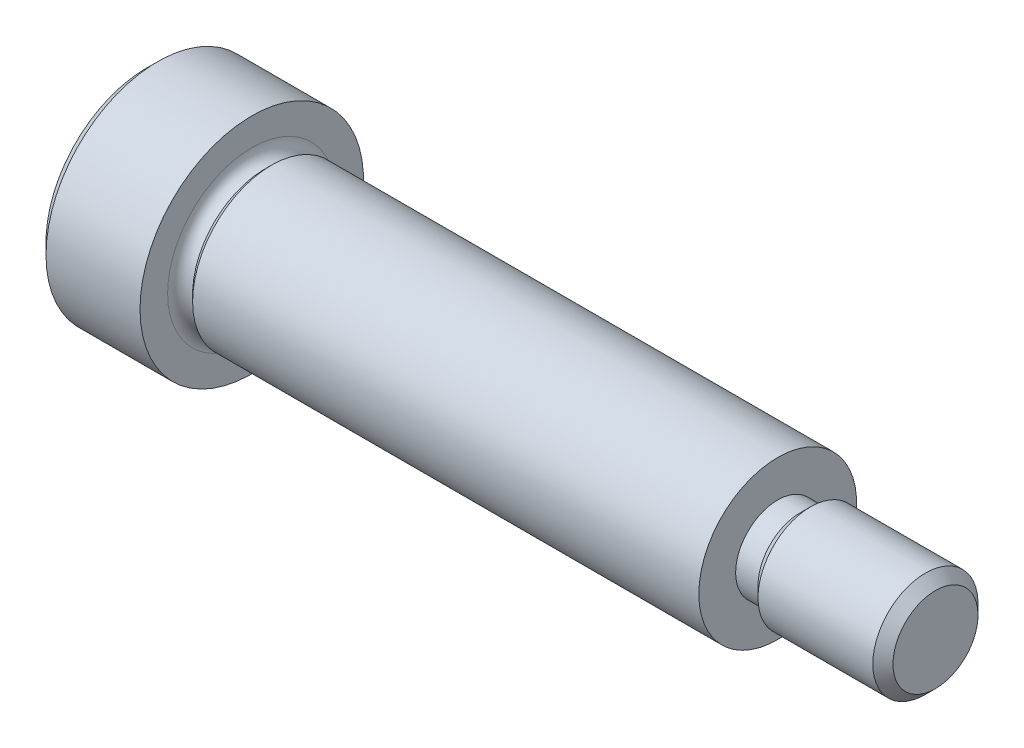
ISO-10303-21;
HEADER;
FILE_DESCRIPTION(('STEP AP214'),'2;1');
FILE_NAME('part.step','',(''),(''),'','','');
FILE_SCHEMA(('AUTOMOTIVE_DESIGN { 1 0 10303 214 1 1 1 1 }'));
ENDSEC;
DATA;
#1=APPLICATION_CONTEXT('core data for automotive mechanical design processes');
#2=APPLICATION_PROTOCOL_DEFINITION('international standard','automotive_design',2000,#1);
#3=PRODUCT_CONTEXT('',#1,'mechanical');
#4=PRODUCT('Part','Part','',(#3));
#5=PRODUCT_RELATED_PRODUCT_CATEGORY('part','',(#4));
#6=PRODUCT_DEFINITION_FORMATION('','',#4);
#7=PRODUCT_DEFINITION_CONTEXT('part definition',#1,'design');
#8=PRODUCT_DEFINITION('design','',#6,#7);
#9=PRODUCT_DEFINITION_SHAPE('','',#8);
#10=(LENGTH_UNIT() NAMED_UNIT(*) SI_UNIT(.MILLI.,.METRE.));
#11=(NAMED_UNIT(*) PLANE_ANGLE_UNIT() SI_UNIT($,.RADIAN.));
#12=(NAMED_UNIT(*) SI_UNIT($,.STERADIAN.) SOLID_ANGLE_UNIT());
#13=UNCERTAINTY_MEASURE_WITH_UNIT(LENGTH_MEASURE(1.E-05),#10,'distance_accuracy_value','');
#14=(GEOMETRIC_REPRESENTATION_CONTEXT(3) GLOBAL_UNCERTAINTY_ASSIGNED_CONTEXT((#13)) GLOBAL_UNIT_ASSIGNED_CONTEXT((#10,
#11,#12)) REPRESENTATION_CONTEXT('',''));
#15=CARTESIAN_POINT('',(0.,0.,0.));
#16=DIRECTION('',(0.,0.,1.));
#17=DIRECTION('',(1.,0.,0.));
#18=AXIS2_PLACEMENT_3D('',#15,#16,#17);
#19=CARTESIAN_POINT('',(-4.,0.,0.));
#20=DIRECTION('',(1.,0.,0.));
#21=DIRECTION('',(0.,0.,-1.));
#22=AXIS2_PLACEMENT_3D('',#19,#20,#21);
#23=PLANE('',#22);
#24=DIRECTION('',(0.,1.,0.));
#25=VECTOR('',#24,1.);
#26=CARTESIAN_POINT('',(-4.,0.,2.99999999999721));
#27=LINE('',#26,#25);
#28=CARTESIAN_POINT('',(-4.0000000000191,0.,2.99999999996453));
#29=VERTEX_POINT('',#28);
#30=CARTESIAN_POINT('',(-4.00000000000054,-1.73205080756995,2.99999999999814));
#31=VERTEX_POINT('',#30);
#32=EDGE_CURVE('E96',#29,#31,#27,.F.);
#33=ORIENTED_EDGE('',*,*,#32,.F.);
#34=CARTESIAN_POINT('',(-4.0000000000191,0.,0.));
#35=DIRECTION('',(-1.,0.,0.));
#36=DIRECTION('',(0.,0.,1.));
#37=AXIS2_PLACEMENT_3D('',#34,#35,#36);
#38=CIRCLE('',#37,2.99999999992906);
#39=CARTESIAN_POINT('',(-4.00000000000955,-2.59807621132259,1.49999999998227));
#40=VERTEX_POINT('',#39);
#41=EDGE_CURVE('E98',#29,#40,#38,.F.);
#42=ORIENTED_EDGE('',*,*,#41,.T.);
#43=DIRECTION('',(0.,-0.499999999999999,-0.866025403784439));
#44=VECTOR('',#43,1.);
#45=CARTESIAN_POINT('',(-4.,-1.73205080756888,3.));
#46=LINE('',#45,#44);
#47=EDGE_CURVE('E101',#31,#40,#46,.T.);
#48=ORIENTED_EDGE('',*,*,#47,.F.);
#49=EDGE_LOOP('',(#33,#42,#48));
#50=FACE_BOUND('',#49,.T.);
#51=ADVANCED_FACE('F17',(#50),#23,.F.);
#52=CARTESIAN_POINT('',(-4.,0.,0.));
#53=DIRECTION('',(1.,0.,0.));
#54=DIRECTION('',(0.,0.,-1.));
#55=AXIS2_PLACEMENT_3D('',#52,#53,#54);
#56=PLANE('',#55);
#57=DIRECTION('',(0.,-0.5,-0.866025403784439));
#58=VECTOR('',#57,1.);
#59=CARTESIAN_POINT('',(-4.,-2.59807621135331,1.50000000000001));
#60=LINE('',#59,#58);
#61=CARTESIAN_POINT('',(-4.,-3.46410161513775,0.));
#62=VERTEX_POINT('',#61);
#63=EDGE_CURVE('E163',#40,#62,#60,.T.);
#64=ORIENTED_EDGE('',*,*,#63,.F.);
#65=CARTESIAN_POINT('',(-4.0000000000191,0.,0.));
#66=DIRECTION('',(-1.,0.,0.));
#67=DIRECTION('',(0.,0.,1.));
#68=AXIS2_PLACEMENT_3D('',#65,#66,#67);
#69=CIRCLE('',#68,2.99999999992906);
#70=CARTESIAN_POINT('',(-4.0000000000191,-2.59807621131293,-1.49999999998784));
#71=VERTEX_POINT('',#70);
#72=EDGE_CURVE('E116',#40,#71,#69,.F.);
#73=ORIENTED_EDGE('',*,*,#72,.T.);
#74=DIRECTION('',(0.,0.500000000005582,-0.866025403781216));
#75=VECTOR('',#74,1.);
#76=CARTESIAN_POINT('',(-4.,-3.46410161513775,0.));
#77=LINE('',#76,#75);
#78=EDGE_CURVE('E159',#62,#71,#77,.T.);
#79=ORIENTED_EDGE('',*,*,#78,.F.);
#80=EDGE_LOOP('',(#64,#73,#79));
#81=FACE_BOUND('',#80,.T.);
#82=ADVANCED_FACE('F533',(#81),#56,.F.);
#83=CARTESIAN_POINT('',(-4.,0.,0.));
#84=DIRECTION('',(1.,0.,0.));
#85=DIRECTION('',(0.,0.,-1.));
#86=AXIS2_PLACEMENT_3D('',#83,#84,#85);
#87=PLANE('',#86);
#88=DIRECTION('',(0.,0.499999999994418,-0.866025403787662));
#89=VECTOR('',#88,1.);
#90=CARTESIAN_POINT('',(-4.,-2.59807621134365,-1.4999999999944));
#91=LINE('',#90,#89);
#92=CARTESIAN_POINT('',(-4.,-1.73205080756887,-3.));
#93=VERTEX_POINT('',#92);
#94=EDGE_CURVE('E155',#71,#93,#91,.T.);
#95=ORIENTED_EDGE('',*,*,#94,.F.);
#96=CARTESIAN_POINT('',(-4.0000000000191,0.,0.));
#97=DIRECTION('',(-1.,0.,0.));
#98=DIRECTION('',(0.,0.,1.));
#99=AXIS2_PLACEMENT_3D('',#96,#97,#98);
#100=CIRCLE('',#99,2.99999999992906);
#101=CARTESIAN_POINT('',(-4.0000000000191,0.,-2.99999999996453));
#102=VERTEX_POINT('',#101);
#103=EDGE_CURVE('E221',#71,#102,#100,.F.);
#104=ORIENTED_EDGE('',*,*,#103,.T.);
#105=DIRECTION('',(0.,1.,0.));
#106=VECTOR('',#105,1.);
#107=CARTESIAN_POINT('',(-4.,0.,-3.));
#108=LINE('',#107,#106);
#109=EDGE_CURVE('E151',#93,#102,#108,.T.);
#110=ORIENTED_EDGE('',*,*,#109,.F.);
#111=EDGE_LOOP('',(#95,#104,#110));
#112=FACE_BOUND('',#111,.T.);
#113=ADVANCED_FACE('F292',(#112),#87,.F.);
#114=CARTESIAN_POINT('',(-4.,0.,0.));
#115=DIRECTION('',(1.,0.,0.));
#116=DIRECTION('',(0.,0.,-1.));
#117=AXIS2_PLACEMENT_3D('',#114,#115,#116);
#118=PLANE('',#117);
#119=DIRECTION('',(0.,1.,0.));
#120=VECTOR('',#119,1.);
#121=CARTESIAN_POINT('',(-4.,0.,-2.99999999998882));
#122=LINE('',#121,#120);
#123=CARTESIAN_POINT('',(-4.,1.73205080757318,-2.99999999999255));
#124=VERTEX_POINT('',#123);
#125=EDGE_CURVE('E147',#102,#124,#122,.T.);
#126=ORIENTED_EDGE('',*,*,#125,.F.);
#127=CARTESIAN_POINT('',(-4.0000000000191,0.,0.));
#128=DIRECTION('',(-1.,0.,0.));
#129=DIRECTION('',(0.,0.,1.));
#130=AXIS2_PLACEMENT_3D('',#127,#128,#129);
#131=CIRCLE('',#130,2.99999999992906);
#132=CARTESIAN_POINT('',(-4.00000000000955,2.59807621132259,-1.49999999998227));
#133=VERTEX_POINT('',#132);
#134=EDGE_CURVE('E218',#102,#133,#131,.F.);
#135=ORIENTED_EDGE('',*,*,#134,.T.);
#136=DIRECTION('',(0.,0.499999999999999,0.866025403784439));
#137=VECTOR('',#136,1.);
#138=CARTESIAN_POINT('',(-4.,1.73205080756888,-3.));
#139=LINE('',#138,#137);
#140=EDGE_CURVE('E143',#124,#133,#139,.T.);
#141=ORIENTED_EDGE('',*,*,#140,.F.);
#142=EDGE_LOOP('',(#126,#135,#141));
#143=FACE_BOUND('',#142,.T.);
#144=ADVANCED_FACE('F278',(#143),#118,.F.);
#145=CARTESIAN_POINT('',(-4.,0.,0.));
#146=DIRECTION('',(1.,0.,0.));
#147=DIRECTION('',(0.,0.,-1.));
#148=AXIS2_PLACEMENT_3D('',#145,#146,#147);
#149=PLANE('',#148);
#150=DIRECTION('',(0.,0.5,0.866025403784439));
#151=VECTOR('',#150,1.);
#152=CARTESIAN_POINT('',(-4.,2.59807621135331,-1.50000000000001));
#153=LINE('',#152,#151);
#154=CARTESIAN_POINT('',(-4.,3.46410161513775,0.));
#155=VERTEX_POINT('',#154);
#156=EDGE_CURVE('E139',#133,#155,#153,.T.);
#157=ORIENTED_EDGE('',*,*,#156,.F.);
#158=CARTESIAN_POINT('',(-4.0000000000191,0.,0.));
#159=DIRECTION('',(-1.,0.,0.));
#160=DIRECTION('',(0.,0.,1.));
#161=AXIS2_PLACEMENT_3D('',#158,#159,#160);
#162=CIRCLE('',#161,2.99999999992906);
#163=CARTESIAN_POINT('',(-4.0000000000191,2.59807621132259,1.49999999998227));
#164=VERTEX_POINT('',#163);
#165=EDGE_CURVE('E125',#133,#164,#162,.F.);
#166=ORIENTED_EDGE('',*,*,#165,.T.);
#167=DIRECTION('',(0.,-0.500000000005583,0.866025403781215));
#168=VECTOR('',#167,1.);
#169=CARTESIAN_POINT('',(-4.,3.46410161513775,0.));
#170=LINE('',#169,#168);
#171=EDGE_CURVE('E117',#155,#164,#170,.T.);
#172=ORIENTED_EDGE('',*,*,#171,.F.);
#173=EDGE_LOOP('',(#157,#166,#172));
#174=FACE_BOUND('',#173,.T.);
#175=ADVANCED_FACE('F282',(#174),#149,.F.);
#176=CARTESIAN_POINT('',(-4.0000000000191,0.,0.));
#177=DIRECTION('',(-1.,0.,0.));
#178=DIRECTION('',(0.,0.,1.));
#179=AXIS2_PLACEMENT_3D('',#176,#177,#178);
#180=CONICAL_SURFACE('',#179,2.99999999992906,1.04719755118004);
#181=CARTESIAN_POINT('',(-2.26794919251461,0.,5.6843418860808E-11));
#182=VERTEX_POINT('',#181);
#183=VERTEX_LOOP('',#182);
#184=FACE_BOUND('',#183,.T.);
#185=ORIENTED_EDGE('',*,*,#41,.F.);
#186=CARTESIAN_POINT('',(-4.0000000000191,0.,0.));
#187=DIRECTION('',(-1.,0.,0.));
#188=DIRECTION('',(0.,0.,1.));
#189=AXIS2_PLACEMENT_3D('',#186,#187,#188);
#190=CIRCLE('',#189,2.99999999992906);
#191=EDGE_CURVE('E112',#29,#164,#190,.T.);
#192=ORIENTED_EDGE('',*,*,#191,.T.);
#193=ORIENTED_EDGE('',*,*,#165,.F.);
#194=ORIENTED_EDGE('',*,*,#134,.F.);
#195=ORIENTED_EDGE('',*,*,#103,.F.);
#196=ORIENTED_EDGE('',*,*,#72,.F.);
#197=EDGE_LOOP('',(#185,#192,#193,#194,#195,#196));
#198=FACE_BOUND('',#197,.T.);
#199=ADVANCED_FACE('F110',(#184,#198),#180,.F.);
#200=CARTESIAN_POINT('',(-4.,0.,0.));
#201=DIRECTION('',(1.,0.,0.));
#202=DIRECTION('',(0.,0.,-1.));
#203=AXIS2_PLACEMENT_3D('',#200,#201,#202);
#204=PLANE('',#203);
#205=DIRECTION('',(0.,0.5,-0.866025403784439));
#206=VECTOR('',#205,1.);
#207=CARTESIAN_POINT('',(-4.,3.46410161513775,0.));
#208=LINE('',#207,#206);
#209=CARTESIAN_POINT('',(-4.,1.73205080756887,3.));
#210=VERTEX_POINT('',#209);
#211=EDGE_CURVE('E124',#164,#210,#208,.F.);
#212=ORIENTED_EDGE('',*,*,#211,.F.);
#213=ORIENTED_EDGE('',*,*,#191,.F.);
#214=DIRECTION('',(0.,1.,0.));
#215=VECTOR('',#214,1.);
#216=CARTESIAN_POINT('',(-4.,1.73205080756888,3.));
#217=LINE('',#216,#215);
#218=EDGE_CURVE('E121',#210,#29,#217,.F.);
#219=ORIENTED_EDGE('',*,*,#218,.F.);
#220=EDGE_LOOP('',(#212,#213,#219));
#221=FACE_BOUND('',#220,.T.);
#222=ADVANCED_FACE('F120',(#221),#204,.F.);
#223=CARTESIAN_POINT('',(-4.,1.73205080756888,3.));
#224=DIRECTION('',(0.,0.,-1.));
#225=DIRECTION('',(-1.,0.,0.));
#226=AXIS2_PLACEMENT_3D('',#223,#224,#225);
#227=PLANE('',#226);
#228=DIRECTION('',(0.,1.,0.));
#229=VECTOR('',#228,1.);
#230=CARTESIAN_POINT('',(-8.,3.,3.));
#231=LINE('',#230,#229);
#232=CARTESIAN_POINT('',(-8.,-1.73205080756888,3.));
#233=VERTEX_POINT('',#232);
#234=CARTESIAN_POINT('',(-8.,1.73205080756888,3.));
#235=VERTEX_POINT('',#234);
#236=EDGE_CURVE('E196',#233,#235,#231,.T.);
#237=ORIENTED_EDGE('',*,*,#236,.T.);
#238=DIRECTION('',(1.,0.,0.));
#239=VECTOR('',#238,1.);
#240=CARTESIAN_POINT('',(-4.,1.73205080756887,3.));
#241=LINE('',#240,#239);
#242=EDGE_CURVE('E129',#210,#235,#241,.F.);
#243=ORIENTED_EDGE('',*,*,#242,.F.);
#244=ORIENTED_EDGE('',*,*,#218,.T.);
#245=ORIENTED_EDGE('',*,*,#32,.T.);
#246=DIRECTION('',(1.,0.,0.));
#247=VECTOR('',#246,1.);
#248=CARTESIAN_POINT('',(-4.,-1.73205080756888,3.));
#249=LINE('',#248,#247);
#250=EDGE_CURVE('E192',#233,#31,#249,.T.);
#251=ORIENTED_EDGE('',*,*,#250,.F.);
#252=EDGE_LOOP('',(#237,#243,#244,#245,#251));
#253=FACE_BOUND('',#252,.T.);
#254=ADVANCED_FACE('F127',(#253),#227,.T.);
#255=CARTESIAN_POINT('',(-4.,3.46410161513775,0.));
#256=DIRECTION('',(0.,-0.866025403784439,-0.5));
#257=DIRECTION('',(0.,0.5,-0.866025403784439));
#258=AXIS2_PLACEMENT_3D('',#255,#256,#257);
#259=PLANE('',#258);
#260=DIRECTION('',(0.,0.5,-0.866025403784438));
#261=VECTOR('',#260,1.);
#262=CARTESIAN_POINT('',(-8.,1.73205080756888,3.));
#263=LINE('',#262,#261);
#264=CARTESIAN_POINT('',(-8.,3.46410161513775,0.));
#265=VERTEX_POINT('',#264);
#266=EDGE_CURVE('E251',#235,#265,#263,.T.);
#267=ORIENTED_EDGE('',*,*,#266,.T.);
#268=DIRECTION('',(1.,0.,0.));
#269=VECTOR('',#268,1.);
#270=CARTESIAN_POINT('',(-4.,3.46410161513775,0.));
#271=LINE('',#270,#269);
#272=EDGE_CURVE('E174',#155,#265,#271,.F.);
#273=ORIENTED_EDGE('',*,*,#272,.F.);
#274=ORIENTED_EDGE('',*,*,#171,.T.);
#275=ORIENTED_EDGE('',*,*,#211,.T.);
#276=ORIENTED_EDGE('',*,*,#242,.T.);
#277=EDGE_LOOP('',(#267,#273,#274,#275,#276));
#278=FACE_BOUND('',#277,.T.);
#279=ADVANCED_FACE('F257',(#278),#259,.T.);
#280=CARTESIAN_POINT('',(-4.,1.73205080756888,-3.));
#281=DIRECTION('',(0.,-0.866025403784439,0.5));
#282=DIRECTION('',(0.,-0.5,-0.866025403784439));
#283=AXIS2_PLACEMENT_3D('',#280,#281,#282);
#284=PLANE('',#283);
#285=DIRECTION('',(0.,-0.500000000000001,-0.866025403784438));
#286=VECTOR('',#285,1.);
#287=CARTESIAN_POINT('',(-8.,3.46410161513776,0.));
#288=LINE('',#287,#286);
#289=CARTESIAN_POINT('',(-8.,1.73205080756888,-3.));
#290=VERTEX_POINT('',#289);
#291=EDGE_CURVE('E249',#265,#290,#288,.T.);
#292=ORIENTED_EDGE('',*,*,#291,.T.);
#293=DIRECTION('',(1.,0.,0.));
#294=VECTOR('',#293,1.);
#295=CARTESIAN_POINT('',(-4.,1.73205080756888,-3.));
#296=LINE('',#295,#294);
#297=EDGE_CURVE('E177',#124,#290,#296,.F.);
#298=ORIENTED_EDGE('',*,*,#297,.F.);
#299=ORIENTED_EDGE('',*,*,#140,.T.);
#300=ORIENTED_EDGE('',*,*,#156,.T.);
#301=ORIENTED_EDGE('',*,*,#272,.T.);
#302=EDGE_LOOP('',(#292,#298,#299,#300,#301));
#303=FACE_BOUND('',#302,.T.);
#304=ADVANCED_FACE('F269',(#303),#284,.T.);
#305=CARTESIAN_POINT('',(-4.,-1.73205080756888,-3.));
#306=DIRECTION('',(0.,0.,1.));
#307=DIRECTION('',(1.,0.,0.));
#308=AXIS2_PLACEMENT_3D('',#305,#306,#307);
#309=PLANE('',#308);
#310=DIRECTION('',(0.,1.,0.));
#311=VECTOR('',#310,1.);
#312=CARTESIAN_POINT('',(-8.,3.,-3.));
#313=LINE('',#312,#311);
#314=CARTESIAN_POINT('',(-8.,-1.73205080756887,-3.));
#315=VERTEX_POINT('',#314);
#316=EDGE_CURVE('E247',#290,#315,#313,.F.);
#317=ORIENTED_EDGE('',*,*,#316,.T.);
#318=DIRECTION('',(1.,0.,0.));
#319=VECTOR('',#318,1.);
#320=CARTESIAN_POINT('',(-4.,-1.73205080756887,-3.));
#321=LINE('',#320,#319);
#322=EDGE_CURVE('E182',#93,#315,#321,.F.);
#323=ORIENTED_EDGE('',*,*,#322,.F.);
#324=ORIENTED_EDGE('',*,*,#109,.T.);
#325=ORIENTED_EDGE('',*,*,#125,.T.);
#326=ORIENTED_EDGE('',*,*,#297,.T.);
#327=EDGE_LOOP('',(#317,#323,#324,#325,#326));
#328=FACE_BOUND('',#327,.T.);
#329=ADVANCED_FACE('F272',(#328),#309,.T.);
#330=CARTESIAN_POINT('',(-4.,-3.46410161513775,0.));
#331=DIRECTION('',(0.,0.866025403784439,0.5));
#332=DIRECTION('',(0.,-0.5,0.866025403784439));
#333=AXIS2_PLACEMENT_3D('',#330,#331,#332);
#334=PLANE('',#333);
#335=DIRECTION('',(0.,-0.5,0.866025403784439));
#336=VECTOR('',#335,1.);
#337=CARTESIAN_POINT('',(-8.,-1.73205080756887,-3.));
#338=LINE('',#337,#336);
#339=CARTESIAN_POINT('',(-8.,-3.46410161513775,0.));
#340=VERTEX_POINT('',#339);
#341=EDGE_CURVE('E245',#315,#340,#338,.T.);
#342=ORIENTED_EDGE('',*,*,#341,.T.);
#343=DIRECTION('',(1.,0.,0.));
#344=VECTOR('',#343,1.);
#345=CARTESIAN_POINT('',(-4.,-3.46410161513775,0.));
#346=LINE('',#345,#344);
#347=EDGE_CURVE('E187',#62,#340,#346,.F.);
#348=ORIENTED_EDGE('',*,*,#347,.F.);
#349=ORIENTED_EDGE('',*,*,#78,.T.);
#350=ORIENTED_EDGE('',*,*,#94,.T.);
#351=ORIENTED_EDGE('',*,*,#322,.T.);
#352=EDGE_LOOP('',(#342,#348,#349,#350,#351));
#353=FACE_BOUND('',#352,.T.);
#354=ADVANCED_FACE('F371',(#353),#334,.T.);
#355=CARTESIAN_POINT('',(-4.,-1.73205080756888,3.));
#356=DIRECTION('',(0.,0.866025403784439,-0.5));
#357=DIRECTION('',(0.,0.5,0.866025403784439));
#358=AXIS2_PLACEMENT_3D('',#355,#356,#357);
#359=PLANE('',#358);
#360=DIRECTION('',(0.,0.499999999999998,0.86602540378444));
#361=VECTOR('',#360,1.);
#362=CARTESIAN_POINT('',(-8.,-3.46410161513775,0.));
#363=LINE('',#362,#361);
#364=EDGE_CURVE('E214',#340,#233,#363,.T.);
#365=ORIENTED_EDGE('',*,*,#364,.T.);
#366=ORIENTED_EDGE('',*,*,#250,.T.);
#367=ORIENTED_EDGE('',*,*,#47,.T.);
#368=ORIENTED_EDGE('',*,*,#63,.T.);
#369=ORIENTED_EDGE('',*,*,#347,.T.);
#370=EDGE_LOOP('',(#365,#366,#367,#368,#369));
#371=FACE_BOUND('',#370,.T.);
#372=ADVANCED_FACE('F368',(#371),#359,.T.);
#373=CARTESIAN_POINT('',(-8.,3.,0.));
#374=DIRECTION('',(1.,0.,0.));
#375=DIRECTION('',(0.,0.,-1.));
#376=AXIS2_PLACEMENT_3D('',#373,#374,#375);
#377=PLANE('',#376);
#378=ORIENTED_EDGE('',*,*,#341,.F.);
#379=ORIENTED_EDGE('',*,*,#316,.F.);
#380=ORIENTED_EDGE('',*,*,#291,.F.);
#381=ORIENTED_EDGE('',*,*,#266,.F.);
#382=ORIENTED_EDGE('',*,*,#236,.F.);
#383=ORIENTED_EDGE('',*,*,#364,.F.);
#384=EDGE_LOOP('',(#378,#379,#380,#381,#382,#383));
#385=FACE_BOUND('',#384,.T.);
#386=CARTESIAN_POINT('',(-7.99999999998136,0.,0.));
#387=DIRECTION('',(1.,0.,0.));
#388=DIRECTION('',(0.,0.,-1.));
#389=AXIS2_PLACEMENT_3D('',#386,#387,#388);
#390=CIRCLE('',#389,7.65000000006921);
#391=CARTESIAN_POINT('',(-7.99999999998136,0.,-7.65000000006921));
#392=VERTEX_POINT('',#391);
#393=EDGE_CURVE('E212',#392,#392,#390,.T.);
#394=ORIENTED_EDGE('',*,*,#393,.F.);
#395=EDGE_LOOP('',(#394));
#396=FACE_BOUND('',#395,.T.);
#397=ADVANCED_FACE('F263',(#385,#396),#377,.F.);
#398=CARTESIAN_POINT('',(52.,3.233,0.));
#399=DIRECTION('',(-1.,0.,0.));
#400=DIRECTION('',(0.,0.,1.));
#401=AXIS2_PLACEMENT_3D('',#398,#399,#400);
#402=PLANE('',#401);
#403=CARTESIAN_POINT('',(52.0000000000209,0.,0.));
#404=DIRECTION('',(-1.,0.,0.));
#405=DIRECTION('',(0.,-1.,0.));
#406=AXIS2_PLACEMENT_3D('',#403,#404,#405);
#407=CIRCLE('',#406,3.23299999996607);
#408=CARTESIAN_POINT('',(52.0000000000209,-3.23299999996607,0.));
#409=VERTEX_POINT('',#408);
#410=EDGE_CURVE('E208',#409,#409,#407,.T.);
#411=ORIENTED_EDGE('',*,*,#410,.F.);
#412=EDGE_LOOP('',(#411));
#413=FACE_BOUND('',#412,.T.);
#414=ADVANCED_FACE('F361',(#413),#402,.F.);
#415=CARTESIAN_POINT('',(-7.15000000013788,0.,0.));
#416=DIRECTION('',(1.,0.,0.));
#417=DIRECTION('',(0.,0.,-1.));
#418=AXIS2_PLACEMENT_3D('',#415,#416,#417);
#419=CONICAL_SURFACE('',#418,8.49999999991269,0.785398163397448);
#420=CARTESIAN_POINT('',(-7.15,0.,0.));
#421=DIRECTION('',(-1.,0.,0.));
#422=DIRECTION('',(0.,0.,1.));
#423=AXIS2_PLACEMENT_3D('',#420,#421,#422);
#424=CIRCLE('',#423,8.5);
#425=CARTESIAN_POINT('',(-7.15,0.,8.5));
#426=VERTEX_POINT('',#425);
#427=EDGE_CURVE('E211',#426,#426,#424,.F.);
#428=ORIENTED_EDGE('',*,*,#427,.F.);
#429=EDGE_LOOP('',(#428));
#430=FACE_BOUND('',#429,.T.);
#431=ORIENTED_EDGE('',*,*,#393,.T.);
#432=EDGE_LOOP('',(#431));
#433=FACE_BOUND('',#432,.T.);
#434=ADVANCED_FACE('F357',(#430,#433),#419,.T.);
#435=CARTESIAN_POINT('',(51.2330000000247,0.,0.));
#436=DIRECTION('',(-1.,0.,0.));
#437=DIRECTION('',(0.,-1.,0.));
#438=AXIS2_PLACEMENT_3D('',#435,#436,#437);
#439=CONICAL_SURFACE('',#438,3.99999999996226,0.785398163397448);
#440=CARTESIAN_POINT('',(51.233,0.,0.));
#441=DIRECTION('',(-1.,0.,0.));
#442=DIRECTION('',(0.,0.,1.));
#443=AXIS2_PLACEMENT_3D('',#440,#441,#442);
#444=CIRCLE('',#443,4.);
#445=CARTESIAN_POINT('',(51.233,0.,4.));
#446=VERTEX_POINT('',#445);
#447=EDGE_CURVE('E207',#446,#446,#444,.T.);
#448=ORIENTED_EDGE('',*,*,#447,.F.);
#449=EDGE_LOOP('',(#448));
#450=FACE_BOUND('',#449,.T.);
#451=ORIENTED_EDGE('',*,*,#410,.T.);
#452=EDGE_LOOP('',(#451));
#453=FACE_BOUND('',#452,.T.);
#454=ADVANCED_FACE('F353',(#450,#453),#439,.T.);
#455=CARTESIAN_POINT('',(67.,0.,0.));
#456=DIRECTION('',(-1.,0.,0.));
#457=DIRECTION('',(0.,0.,1.));
#458=AXIS2_PLACEMENT_3D('',#455,#456,#457);
#459=CYLINDRICAL_SURFACE('',#458,8.5);
#460=ORIENTED_EDGE('',*,*,#427,.T.);
#461=EDGE_LOOP('',(#460));
#462=FACE_BOUND('',#461,.T.);
#463=CARTESIAN_POINT('',(0.,0.,0.));
#464=DIRECTION('',(-1.,0.,0.));
#465=DIRECTION('',(0.,0.,1.));
#466=AXIS2_PLACEMENT_3D('',#463,#464,#465);
#467=CIRCLE('',#466,8.5);
#468=CARTESIAN_POINT('',(0.,0.,8.5));
#469=VERTEX_POINT('',#468);
#470=EDGE_CURVE('E203',#469,#469,#467,.T.);
#471=ORIENTED_EDGE('',*,*,#470,.T.);
#472=EDGE_LOOP('',(#471));
#473=FACE_BOUND('',#472,.T.);
#474=ADVANCED_FACE('F349',(#462,#473),#459,.T.);
#475=CARTESIAN_POINT('',(52.,0.,0.));
#476=DIRECTION('',(-1.,0.,0.));
#477=DIRECTION('',(0.,0.,1.));
#478=AXIS2_PLACEMENT_3D('',#475,#476,#477);
#479=CYLINDRICAL_SURFACE('',#478,4.);
#480=CARTESIAN_POINT('',(42.5000000000182,0.,0.));
#481=DIRECTION('',(1.,0.,0.));
#482=DIRECTION('',(0.,0.,-1.));
#483=AXIS2_PLACEMENT_3D('',#480,#481,#482);
#484=CIRCLE('',#483,4.0000000000191);
#485=CARTESIAN_POINT('',(42.5000000000182,0.,-4.0000000000191));
#486=VERTEX_POINT('',#485);
#487=EDGE_CURVE('E206',#486,#486,#484,.F.);
#488=ORIENTED_EDGE('',*,*,#487,.F.);
#489=EDGE_LOOP('',(#488));
#490=FACE_BOUND('',#489,.T.);
#491=ORIENTED_EDGE('',*,*,#447,.T.);
#492=EDGE_LOOP('',(#491));
#493=FACE_BOUND('',#492,.T.);
#494=ADVANCED_FACE('F338',(#490,#493),#479,.T.);
#495=CARTESIAN_POINT('',(0.,8.5,0.));
#496=DIRECTION('',(-1.,0.,0.));
#497=DIRECTION('',(0.,0.,1.));
#498=AXIS2_PLACEMENT_3D('',#495,#496,#497);
#499=PLANE('',#498);
#500=CARTESIAN_POINT('',(0.,0.,0.));
#501=DIRECTION('',(1.,0.,0.));
#502=DIRECTION('',(0.,0.,-1.));
#503=AXIS2_PLACEMENT_3D('',#500,#501,#502);
#504=CIRCLE('',#503,6.4);
#505=CARTESIAN_POINT('',(0.,0.,6.4));
#506=VERTEX_POINT('',#505);
#507=CARTESIAN_POINT('',(0.,0.,-6.39999999999999));
#508=VERTEX_POINT('',#507);
#509=EDGE_CURVE('E36',#506,#508,#504,.F.);
#510=ORIENTED_EDGE('',*,*,#509,.T.);
#511=CARTESIAN_POINT('',(0.,0.,0.));
#512=DIRECTION('',(1.,0.,0.));
#513=DIRECTION('',(0.,0.,1.));
#514=AXIS2_PLACEMENT_3D('',#511,#512,#513);
#515=CIRCLE('',#514,6.39999999999998);
#516=EDGE_CURVE('E225',#508,#506,#515,.F.);
#517=ORIENTED_EDGE('',*,*,#516,.T.);
#518=EDGE_LOOP('',(#510,#517));
#519=FACE_BOUND('',#518,.T.);
#520=ORIENTED_EDGE('',*,*,#470,.F.);
#521=EDGE_LOOP('',(#520));
#522=FACE_BOUND('',#521,.T.);
#523=ADVANCED_FACE('F329',(#519,#522),#499,.F.);
#524=CARTESIAN_POINT('',(42.5000000000182,0.,0.));
#525=DIRECTION('',(1.,0.,0.));
#526=DIRECTION('',(0.,0.,-1.));
#527=AXIS2_PLACEMENT_3D('',#524,#525,#526);
#528=CONICAL_SURFACE('',#527,4.0000000000191,0.785398163397448);
#529=CARTESIAN_POINT('',(41.7,0.,0.));
#530=DIRECTION('',(-1.,0.,0.));
#531=DIRECTION('',(0.,0.,1.));
#532=AXIS2_PLACEMENT_3D('',#529,#530,#531);
#533=CIRCLE('',#532,3.2);
#534=CARTESIAN_POINT('',(41.7,0.,3.2));
#535=VERTEX_POINT('',#534);
#536=EDGE_CURVE('E230',#535,#535,#533,.T.);
#537=ORIENTED_EDGE('',*,*,#536,.F.);
#538=EDGE_LOOP('',(#537));
#539=FACE_BOUND('',#538,.T.);
#540=ORIENTED_EDGE('',*,*,#487,.T.);
#541=EDGE_LOOP('',(#540));
#542=FACE_BOUND('',#541,.T.);
#543=ADVANCED_FACE('F317',(#539,#542),#528,.T.);
#544=CARTESIAN_POINT('',(0.881621241910936,0.,0.));
#545=DIRECTION('',(1.,0.,0.));
#546=DIRECTION('',(0.,0.,-1.));
#547=AXIS2_PLACEMENT_3D('',#544,#545,#546);
#548=TOROIDAL_SURFACE('',#547,6.37415457852114,0.882);
#549=ORIENTED_EDGE('',*,*,#509,.F.);
#550=ORIENTED_EDGE('',*,*,#516,.F.);
#551=EDGE_LOOP('',(#549,#550));
#552=FACE_BOUND('',#551,.T.);
#553=CARTESIAN_POINT('',(0.998999999978878,0.,0.));
#554=DIRECTION('',(1.,0.,0.));
#555=DIRECTION('',(0.,0.,-1.));
#556=AXIS2_PLACEMENT_3D('',#553,#554,#555);
#557=CIRCLE('',#556,5.49999999998363);
#558=CARTESIAN_POINT('',(0.998999999978878,0.,-5.49999999998363));
#559=VERTEX_POINT('',#558);
#560=EDGE_CURVE('E202',#559,#559,#557,.T.);
#561=ORIENTED_EDGE('',*,*,#560,.F.);
#562=EDGE_LOOP('',(#561));
#563=FACE_BOUND('',#562,.T.);
#564=ADVANCED_FACE('F226',(#552,#563),#548,.F.);
#565=CARTESIAN_POINT('',(52.,0.,0.));
#566=DIRECTION('',(-1.,0.,0.));
#567=DIRECTION('',(0.,0.,1.));
#568=AXIS2_PLACEMENT_3D('',#565,#566,#567);
#569=CYLINDRICAL_SURFACE('',#568,3.2);
#570=ORIENTED_EDGE('',*,*,#536,.T.);
#571=EDGE_LOOP('',(#570));
#572=FACE_BOUND('',#571,.T.);
#573=CARTESIAN_POINT('',(40.,0.,0.));
#574=DIRECTION('',(-1.,0.,0.));
#575=DIRECTION('',(0.,0.,1.));
#576=AXIS2_PLACEMENT_3D('',#573,#574,#575);
#577=CIRCLE('',#576,3.2);
#578=CARTESIAN_POINT('',(40.,0.,3.2));
#579=VERTEX_POINT('',#578);
#580=EDGE_CURVE('E199',#579,#579,#577,.F.);
#581=ORIENTED_EDGE('',*,*,#580,.T.);
#582=EDGE_LOOP('',(#581));
#583=FACE_BOUND('',#582,.T.);
#584=ADVANCED_FACE('F309',(#572,#583),#569,.T.);
#585=CARTESIAN_POINT('',(1.49900000008074,0.,0.));
#586=DIRECTION('',(1.,0.,0.));
#587=DIRECTION('',(0.,0.,-1.));
#588=AXIS2_PLACEMENT_3D('',#585,#586,#587);
#589=CONICAL_SURFACE('',#588,6.00000000008549,0.785398163397448);
#590=CARTESIAN_POINT('',(1.499,0.,0.));
#591=DIRECTION('',(-1.,0.,0.));
#592=DIRECTION('',(0.,0.,1.));
#593=AXIS2_PLACEMENT_3D('',#590,#591,#592);
#594=CIRCLE('',#593,6.);
#595=CARTESIAN_POINT('',(1.499,0.,6.));
#596=VERTEX_POINT('',#595);
#597=EDGE_CURVE('E28',#596,#596,#594,.F.);
#598=ORIENTED_EDGE('',*,*,#597,.F.);
#599=EDGE_LOOP('',(#598));
#600=FACE_BOUND('',#599,.T.);
#601=ORIENTED_EDGE('',*,*,#560,.T.);
#602=EDGE_LOOP('',(#601));
#603=FACE_BOUND('',#602,.T.);
#604=ADVANCED_FACE('F302',(#600,#603),#589,.T.);
#605=CARTESIAN_POINT('',(40.,6.,0.));
#606=DIRECTION('',(-1.,0.,0.));
#607=DIRECTION('',(0.,0.,1.));
#608=AXIS2_PLACEMENT_3D('',#605,#606,#607);
#609=PLANE('',#608);
#610=CARTESIAN_POINT('',(40.,0.,0.));
#611=DIRECTION('',(-1.,0.,0.));
#612=DIRECTION('',(0.,0.,1.));
#613=AXIS2_PLACEMENT_3D('',#610,#611,#612);
#614=CIRCLE('',#613,6.);
#615=CARTESIAN_POINT('',(40.,0.,6.));
#616=VERTEX_POINT('',#615);
#617=EDGE_CURVE('E11',#616,#616,#614,.T.);
#618=ORIENTED_EDGE('',*,*,#617,.F.);
#619=EDGE_LOOP('',(#618));
#620=FACE_BOUND('',#619,.T.);
#621=ORIENTED_EDGE('',*,*,#580,.F.);
#622=EDGE_LOOP('',(#621));
#623=FACE_BOUND('',#622,.T.);
#624=ADVANCED_FACE('F296',(#620,#623),#609,.F.);
#625=CARTESIAN_POINT('',(67.,0.,0.));
#626=DIRECTION('',(-1.,0.,0.));
#627=DIRECTION('',(0.,0.,1.));
#628=AXIS2_PLACEMENT_3D('',#625,#626,#627);
#629=CYLINDRICAL_SURFACE('',#628,6.);
#630=ORIENTED_EDGE('',*,*,#617,.T.);
#631=EDGE_LOOP('',(#630));
#632=FACE_BOUND('',#631,.T.);
#633=ORIENTED_EDGE('',*,*,#597,.T.);
#634=EDGE_LOOP('',(#633));
#635=FACE_BOUND('',#634,.T.);
#636=ADVANCED_FACE('F294',(#632,#635),#629,.T.);
#637=CLOSED_SHELL('',(#51,#82,#113,#144,#175,#199,#222,#254,#279,#304,#329,#354,#372,#397,#414,
#434,#454,#474,#494,#523,#543,#564,#584,#604,#624,#636));
#638=MANIFOLD_SOLID_BREP('B1',#637);
#639=ADVANCED_BREP_SHAPE_REPRESENTATION('',(#18,#638),#14);
#640=SHAPE_DEFINITION_REPRESENTATION(#9,#639);
ENDSEC;
END-ISO-10303-21;
